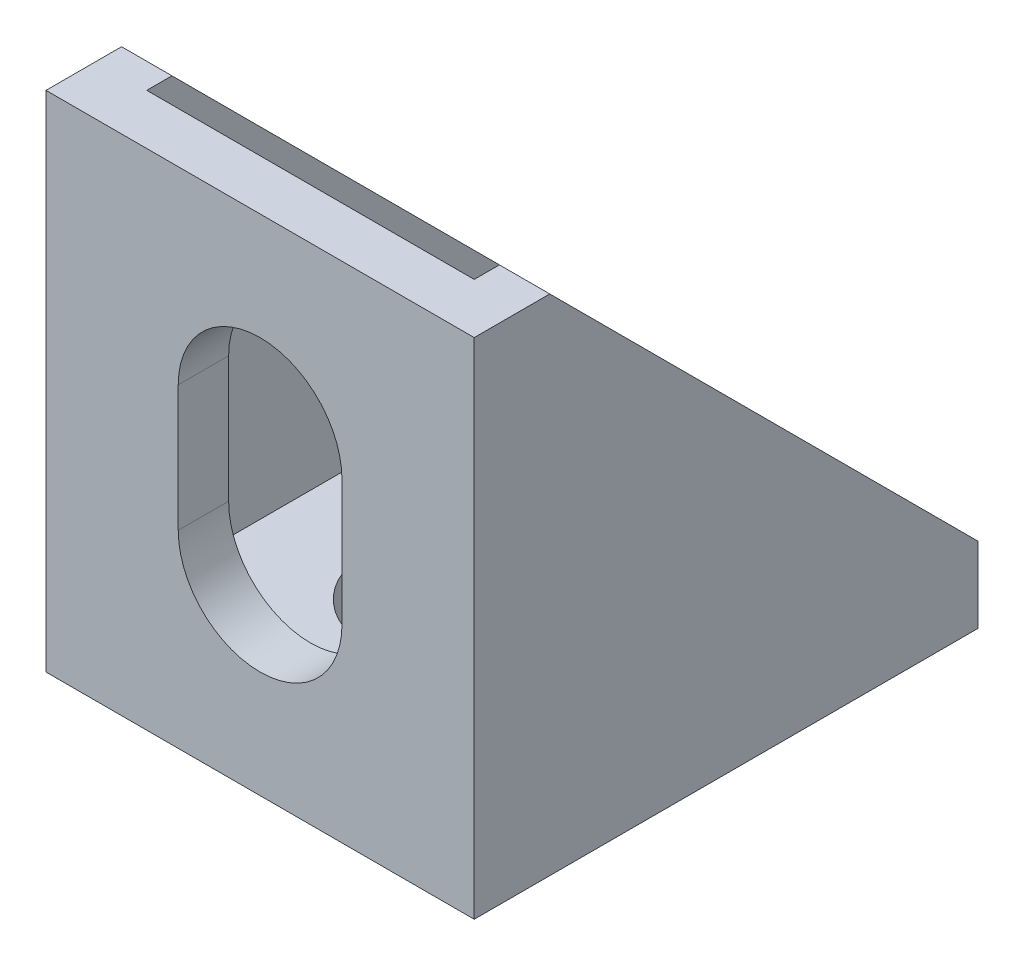
ISO-10303-21;
HEADER;
FILE_DESCRIPTION(('STEP AP214'),'2;1');
FILE_NAME('part.step','',(''),(''),'','','');
FILE_SCHEMA(('AUTOMOTIVE_DESIGN { 1 0 10303 214 1 1 1 1 }'));
ENDSEC;
DATA;
#1=APPLICATION_CONTEXT('core data for automotive mechanical design processes');
#2=APPLICATION_PROTOCOL_DEFINITION('international standard','automotive_design',2000,#1);
#3=PRODUCT_CONTEXT('',#1,'mechanical');
#4=PRODUCT('Part','Part','',(#3));
#5=PRODUCT_RELATED_PRODUCT_CATEGORY('part','',(#4));
#6=PRODUCT_DEFINITION_FORMATION('','',#4);
#7=PRODUCT_DEFINITION_CONTEXT('part definition',#1,'design');
#8=PRODUCT_DEFINITION('design','',#6,#7);
#9=PRODUCT_DEFINITION_SHAPE('','',#8);
#10=(LENGTH_UNIT() NAMED_UNIT(*) SI_UNIT(.MILLI.,.METRE.));
#11=(NAMED_UNIT(*) PLANE_ANGLE_UNIT() SI_UNIT($,.RADIAN.));
#12=(NAMED_UNIT(*) SI_UNIT($,.STERADIAN.) SOLID_ANGLE_UNIT());
#13=UNCERTAINTY_MEASURE_WITH_UNIT(LENGTH_MEASURE(1.E-05),#10,'distance_accuracy_value','');
#14=(GEOMETRIC_REPRESENTATION_CONTEXT(3) GLOBAL_UNCERTAINTY_ASSIGNED_CONTEXT((#13)) GLOBAL_UNIT_ASSIGNED_CONTEXT((#10,
#11,#12)) REPRESENTATION_CONTEXT('',''));
#15=CARTESIAN_POINT('',(0.,0.,0.));
#16=DIRECTION('',(0.,0.,1.));
#17=DIRECTION('',(1.,0.,0.));
#18=AXIS2_PLACEMENT_3D('',#15,#16,#17);
#19=CARTESIAN_POINT('',(8.5,3.,-20.));
#20=DIRECTION('',(0.,-0.707106781186548,0.707106781186548));
#21=DIRECTION('',(0.,-0.707106781186548,-0.707106781186548));
#22=AXIS2_PLACEMENT_3D('',#19,#20,#21);
#23=PLANE('',#22);
#24=DIRECTION('',(-1.,0.,0.));
#25=VECTOR('',#24,1.);
#26=CARTESIAN_POINT('',(8.5,3.,-20.));
#27=LINE('',#26,#25);
#28=CARTESIAN_POINT('',(8.5,3.,-20.));
#29=VERTEX_POINT('',#28);
#30=CARTESIAN_POINT('',(6.5,3.,-20.));
#31=VERTEX_POINT('',#30);
#32=EDGE_CURVE('E274',#29,#31,#27,.T.);
#33=ORIENTED_EDGE('',*,*,#32,.T.);
#34=DIRECTION('',(0.,0.707106781186548,0.707106781186548));
#35=VECTOR('',#34,1.);
#36=CARTESIAN_POINT('',(6.5,3.,-20.));
#37=LINE('',#36,#35);
#38=CARTESIAN_POINT('',(6.5,20.,-3.));
#39=VERTEX_POINT('',#38);
#40=EDGE_CURVE('E247',#31,#39,#37,.T.);
#41=ORIENTED_EDGE('',*,*,#40,.T.);
#42=DIRECTION('',(-1.,0.,0.));
#43=VECTOR('',#42,1.);
#44=CARTESIAN_POINT('',(8.5,20.,-3.));
#45=LINE('',#44,#43);
#46=CARTESIAN_POINT('',(8.5,20.,-3.));
#47=VERTEX_POINT('',#46);
#48=EDGE_CURVE('E12',#47,#39,#45,.T.);
#49=ORIENTED_EDGE('',*,*,#48,.F.);
#50=DIRECTION('',(0.,0.707106781186547,0.707106781186547));
#51=VECTOR('',#50,1.);
#52=CARTESIAN_POINT('',(8.5,3.,-20.));
#53=LINE('',#52,#51);
#54=EDGE_CURVE('E251',#29,#47,#53,.T.);
#55=ORIENTED_EDGE('',*,*,#54,.F.);
#56=EDGE_LOOP('',(#33,#41,#49,#55));
#57=FACE_BOUND('',#56,.T.);
#58=ADVANCED_FACE('F35',(#57),#23,.F.);
#59=CARTESIAN_POINT('',(-6.5,20.,-3.));
#60=VERTEX_POINT('',#59);
#61=CARTESIAN_POINT('',(-8.5,20.,-3.));
#62=VERTEX_POINT('',#61);
#63=EDGE_CURVE('E43',#60,#62,#45,.T.);
#64=ORIENTED_EDGE('',*,*,#63,.F.);
#65=DIRECTION('',(0.,-0.707106781186548,-0.707106781186548));
#66=VECTOR('',#65,1.);
#67=CARTESIAN_POINT('',(-6.5,3.,-20.));
#68=LINE('',#67,#66);
#69=CARTESIAN_POINT('',(-6.5,3.,-20.));
#70=VERTEX_POINT('',#69);
#71=EDGE_CURVE('E244',#60,#70,#68,.T.);
#72=ORIENTED_EDGE('',*,*,#71,.T.);
#73=CARTESIAN_POINT('',(-8.5,3.,-20.));
#74=VERTEX_POINT('',#73);
#75=EDGE_CURVE('E263',#70,#74,#27,.T.);
#76=ORIENTED_EDGE('',*,*,#75,.T.);
#77=DIRECTION('',(0.,0.707106781186547,0.707106781186547));
#78=VECTOR('',#77,1.);
#79=CARTESIAN_POINT('',(-8.5,3.,-20.));
#80=LINE('',#79,#78);
#81=EDGE_CURVE('E250',#74,#62,#80,.T.);
#82=ORIENTED_EDGE('',*,*,#81,.T.);
#83=EDGE_LOOP('',(#64,#72,#76,#82));
#84=FACE_BOUND('',#83,.T.);
#85=ADVANCED_FACE('F37',(#84),#23,.F.);
#86=CARTESIAN_POINT('',(8.5,20.,-3.));
#87=DIRECTION('',(0.,-1.,0.));
#88=DIRECTION('',(0.,0.,-1.));
#89=AXIS2_PLACEMENT_3D('',#86,#87,#88);
#90=PLANE('',#89);
#91=ORIENTED_EDGE('',*,*,#48,.T.);
#92=DIRECTION('',(0.,0.,-1.));
#93=VECTOR('',#92,1.);
#94=CARTESIAN_POINT('',(6.5,20.,21.4009345590327));
#95=LINE('',#94,#93);
#96=CARTESIAN_POINT('',(6.5,20.,-2.));
#97=VERTEX_POINT('',#96);
#98=EDGE_CURVE('E227',#97,#39,#95,.T.);
#99=ORIENTED_EDGE('',*,*,#98,.F.);
#100=DIRECTION('',(-1.,0.,0.));
#101=VECTOR('',#100,1.);
#102=CARTESIAN_POINT('',(6.5,20.,-2.));
#103=LINE('',#102,#101);
#104=CARTESIAN_POINT('',(-6.5,20.,-2.));
#105=VERTEX_POINT('',#104);
#106=EDGE_CURVE('E226',#97,#105,#103,.T.);
#107=ORIENTED_EDGE('',*,*,#106,.T.);
#108=DIRECTION('',(0.,0.,-1.));
#109=VECTOR('',#108,1.);
#110=CARTESIAN_POINT('',(-6.5,20.,21.4009345590327));
#111=LINE('',#110,#109);
#112=EDGE_CURVE('E237',#105,#60,#111,.T.);
#113=ORIENTED_EDGE('',*,*,#112,.T.);
#114=ORIENTED_EDGE('',*,*,#63,.T.);
#115=DIRECTION('',(0.,0.,1.));
#116=VECTOR('',#115,1.);
#117=CARTESIAN_POINT('',(-8.5,20.,-3.));
#118=LINE('',#117,#116);
#119=CARTESIAN_POINT('',(-8.5,20.,0.));
#120=VERTEX_POINT('',#119);
#121=EDGE_CURVE('E266',#62,#120,#118,.T.);
#122=ORIENTED_EDGE('',*,*,#121,.T.);
#123=DIRECTION('',(-1.,0.,0.));
#124=VECTOR('',#123,1.);
#125=CARTESIAN_POINT('',(8.5,20.,0.));
#126=LINE('',#125,#124);
#127=CARTESIAN_POINT('',(8.5,20.,0.));
#128=VERTEX_POINT('',#127);
#129=EDGE_CURVE('E282',#128,#120,#126,.T.);
#130=ORIENTED_EDGE('',*,*,#129,.F.);
#131=DIRECTION('',(0.,0.,1.));
#132=VECTOR('',#131,1.);
#133=CARTESIAN_POINT('',(8.5,20.,-3.));
#134=LINE('',#133,#132);
#135=EDGE_CURVE('E254',#47,#128,#134,.T.);
#136=ORIENTED_EDGE('',*,*,#135,.F.);
#137=EDGE_LOOP('',(#91,#99,#107,#113,#114,#122,#130,#136));
#138=FACE_BOUND('',#137,.T.);
#139=ADVANCED_FACE('F291',(#138),#90,.F.);
#140=CARTESIAN_POINT('',(8.5,20.,0.));
#141=DIRECTION('',(0.,0.,-1.));
#142=DIRECTION('',(0.,1.,0.));
#143=AXIS2_PLACEMENT_3D('',#140,#141,#142);
#144=PLANE('',#143);
#145=DIRECTION('',(0.,-1.,0.));
#146=VECTOR('',#145,1.);
#147=CARTESIAN_POINT('',(3.25,7.5,0.));
#148=LINE('',#147,#146);
#149=CARTESIAN_POINT('',(3.25,12.5,0.));
#150=VERTEX_POINT('',#149);
#151=CARTESIAN_POINT('',(3.25,7.5,0.));
#152=VERTEX_POINT('',#151);
#153=EDGE_CURVE('E202',#150,#152,#148,.T.);
#154=ORIENTED_EDGE('',*,*,#153,.T.);
#155=CARTESIAN_POINT('',(0.,7.5,0.));
#156=DIRECTION('',(0.,0.,-1.));
#157=DIRECTION('',(0.,1.,0.));
#158=AXIS2_PLACEMENT_3D('',#155,#156,#157);
#159=CIRCLE('',#158,3.25);
#160=CARTESIAN_POINT('',(-3.25,7.5,0.));
#161=VERTEX_POINT('',#160);
#162=EDGE_CURVE('E192',#152,#161,#159,.T.);
#163=ORIENTED_EDGE('',*,*,#162,.T.);
#164=DIRECTION('',(0.,1.,0.));
#165=VECTOR('',#164,1.);
#166=CARTESIAN_POINT('',(-3.25,7.5,0.));
#167=LINE('',#166,#165);
#168=CARTESIAN_POINT('',(-3.25,12.5,0.));
#169=VERTEX_POINT('',#168);
#170=EDGE_CURVE('E195',#161,#169,#167,.T.);
#171=ORIENTED_EDGE('',*,*,#170,.T.);
#172=CARTESIAN_POINT('',(0.,12.5,0.));
#173=DIRECTION('',(0.,0.,-1.));
#174=DIRECTION('',(0.,1.,0.));
#175=AXIS2_PLACEMENT_3D('',#172,#173,#174);
#176=CIRCLE('',#175,3.25);
#177=EDGE_CURVE('E199',#169,#150,#176,.T.);
#178=ORIENTED_EDGE('',*,*,#177,.T.);
#179=EDGE_LOOP('',(#154,#163,#171,#178));
#180=FACE_BOUND('',#179,.T.);
#181=DIRECTION('',(0.,-1.,0.));
#182=VECTOR('',#181,1.);
#183=CARTESIAN_POINT('',(-8.5,20.,0.));
#184=LINE('',#183,#182);
#185=CARTESIAN_POINT('',(-8.5,0.,0.));
#186=VERTEX_POINT('',#185);
#187=EDGE_CURVE('E268',#120,#186,#184,.T.);
#188=ORIENTED_EDGE('',*,*,#187,.T.);
#189=DIRECTION('',(-1.,0.,0.));
#190=VECTOR('',#189,1.);
#191=CARTESIAN_POINT('',(8.5,0.,0.));
#192=LINE('',#191,#190);
#193=CARTESIAN_POINT('',(8.5,0.,0.));
#194=VERTEX_POINT('',#193);
#195=EDGE_CURVE('E280',#194,#186,#192,.T.);
#196=ORIENTED_EDGE('',*,*,#195,.F.);
#197=DIRECTION('',(0.,-1.,0.));
#198=VECTOR('',#197,1.);
#199=CARTESIAN_POINT('',(8.5,20.,0.));
#200=LINE('',#199,#198);
#201=EDGE_CURVE('E257',#128,#194,#200,.T.);
#202=ORIENTED_EDGE('',*,*,#201,.F.);
#203=ORIENTED_EDGE('',*,*,#129,.T.);
#204=EDGE_LOOP('',(#188,#196,#202,#203));
#205=FACE_BOUND('',#204,.T.);
#206=ADVANCED_FACE('F309',(#180,#205),#144,.F.);
#207=CARTESIAN_POINT('',(8.5,0.,0.));
#208=DIRECTION('',(0.,1.,0.));
#209=DIRECTION('',(0.,0.,1.));
#210=AXIS2_PLACEMENT_3D('',#207,#208,#209);
#211=PLANE('',#210);
#212=DIRECTION('',(0.,0.,1.));
#213=VECTOR('',#212,1.);
#214=CARTESIAN_POINT('',(-3.25,0.,0.));
#215=LINE('',#214,#213);
#216=CARTESIAN_POINT('',(-3.25,0.,-12.5));
#217=VERTEX_POINT('',#216);
#218=CARTESIAN_POINT('',(-3.25,0.,-7.5));
#219=VERTEX_POINT('',#218);
#220=EDGE_CURVE('E185',#217,#219,#215,.T.);
#221=ORIENTED_EDGE('',*,*,#220,.T.);
#222=CARTESIAN_POINT('',(0.,0.,-7.5));
#223=DIRECTION('',(0.,1.,0.));
#224=DIRECTION('',(0.,0.,1.));
#225=AXIS2_PLACEMENT_3D('',#222,#223,#224);
#226=CIRCLE('',#225,3.25);
#227=CARTESIAN_POINT('',(3.25,0.,-7.5));
#228=VERTEX_POINT('',#227);
#229=EDGE_CURVE('E188',#219,#228,#226,.T.);
#230=ORIENTED_EDGE('',*,*,#229,.T.);
#231=DIRECTION('',(0.,0.,-1.));
#232=VECTOR('',#231,1.);
#233=CARTESIAN_POINT('',(3.25,0.,0.));
#234=LINE('',#233,#232);
#235=CARTESIAN_POINT('',(3.25,0.,-12.5));
#236=VERTEX_POINT('',#235);
#237=EDGE_CURVE('E180',#228,#236,#234,.T.);
#238=ORIENTED_EDGE('',*,*,#237,.T.);
#239=CARTESIAN_POINT('',(0.,0.,-12.5));
#240=DIRECTION('',(0.,1.,0.));
#241=DIRECTION('',(0.,0.,1.));
#242=AXIS2_PLACEMENT_3D('',#239,#240,#241);
#243=CIRCLE('',#242,3.25);
#244=EDGE_CURVE('E160',#236,#217,#243,.T.);
#245=ORIENTED_EDGE('',*,*,#244,.T.);
#246=EDGE_LOOP('',(#221,#230,#238,#245));
#247=FACE_BOUND('',#246,.T.);
#248=DIRECTION('',(0.,0.,-1.));
#249=VECTOR('',#248,1.);
#250=CARTESIAN_POINT('',(-8.5,0.,0.));
#251=LINE('',#250,#249);
#252=CARTESIAN_POINT('',(-8.5,0.,-20.));
#253=VERTEX_POINT('',#252);
#254=EDGE_CURVE('E270',#186,#253,#251,.T.);
#255=ORIENTED_EDGE('',*,*,#254,.T.);
#256=DIRECTION('',(-1.,0.,0.));
#257=VECTOR('',#256,1.);
#258=CARTESIAN_POINT('',(8.5,0.,-20.));
#259=LINE('',#258,#257);
#260=CARTESIAN_POINT('',(8.5,0.,-20.));
#261=VERTEX_POINT('',#260);
#262=EDGE_CURVE('E277',#261,#253,#259,.T.);
#263=ORIENTED_EDGE('',*,*,#262,.F.);
#264=DIRECTION('',(0.,0.,-1.));
#265=VECTOR('',#264,1.);
#266=CARTESIAN_POINT('',(8.5,0.,0.));
#267=LINE('',#266,#265);
#268=EDGE_CURVE('E259',#194,#261,#267,.T.);
#269=ORIENTED_EDGE('',*,*,#268,.F.);
#270=ORIENTED_EDGE('',*,*,#195,.T.);
#271=EDGE_LOOP('',(#255,#263,#269,#270));
#272=FACE_BOUND('',#271,.T.);
#273=ADVANCED_FACE('F306',(#247,#272),#211,.F.);
#274=CARTESIAN_POINT('',(8.5,0.,-20.));
#275=DIRECTION('',(0.,0.,1.));
#276=DIRECTION('',(1.,0.,0.));
#277=AXIS2_PLACEMENT_3D('',#274,#275,#276);
#278=PLANE('',#277);
#279=DIRECTION('',(0.,1.,0.));
#280=VECTOR('',#279,1.);
#281=CARTESIAN_POINT('',(-8.5,0.,-20.));
#282=LINE('',#281,#280);
#283=EDGE_CURVE('E255',#253,#74,#282,.T.);
#284=ORIENTED_EDGE('',*,*,#283,.T.);
#285=ORIENTED_EDGE('',*,*,#75,.F.);
#286=DIRECTION('',(-1.,0.,0.));
#287=VECTOR('',#286,1.);
#288=CARTESIAN_POINT('',(6.5,3.,-20.));
#289=LINE('',#288,#287);
#290=EDGE_CURVE('E217',#31,#70,#289,.T.);
#291=ORIENTED_EDGE('',*,*,#290,.F.);
#292=ORIENTED_EDGE('',*,*,#32,.F.);
#293=DIRECTION('',(0.,1.,0.));
#294=VECTOR('',#293,1.);
#295=CARTESIAN_POINT('',(8.5,0.,-20.));
#296=LINE('',#295,#294);
#297=EDGE_CURVE('E261',#261,#29,#296,.T.);
#298=ORIENTED_EDGE('',*,*,#297,.F.);
#299=ORIENTED_EDGE('',*,*,#262,.T.);
#300=EDGE_LOOP('',(#284,#285,#291,#292,#298,#299));
#301=FACE_BOUND('',#300,.T.);
#302=ADVANCED_FACE('F302',(#301),#278,.F.);
#303=CARTESIAN_POINT('',(8.5,0.,0.));
#304=DIRECTION('',(1.,0.,0.));
#305=DIRECTION('',(0.,0.,-1.));
#306=AXIS2_PLACEMENT_3D('',#303,#304,#305);
#307=PLANE('',#306);
#308=ORIENTED_EDGE('',*,*,#54,.T.);
#309=ORIENTED_EDGE('',*,*,#135,.T.);
#310=ORIENTED_EDGE('',*,*,#201,.T.);
#311=ORIENTED_EDGE('',*,*,#268,.T.);
#312=ORIENTED_EDGE('',*,*,#297,.T.);
#313=EDGE_LOOP('',(#308,#309,#310,#311,#312));
#314=FACE_BOUND('',#313,.T.);
#315=ADVANCED_FACE('F311',(#314),#307,.T.);
#316=CARTESIAN_POINT('',(-8.5,0.,0.));
#317=DIRECTION('',(1.,0.,0.));
#318=DIRECTION('',(0.,0.,-1.));
#319=AXIS2_PLACEMENT_3D('',#316,#317,#318);
#320=PLANE('',#319);
#321=ORIENTED_EDGE('',*,*,#81,.F.);
#322=ORIENTED_EDGE('',*,*,#283,.F.);
#323=ORIENTED_EDGE('',*,*,#254,.F.);
#324=ORIENTED_EDGE('',*,*,#187,.F.);
#325=ORIENTED_EDGE('',*,*,#121,.F.);
#326=EDGE_LOOP('',(#321,#322,#323,#324,#325));
#327=FACE_BOUND('',#326,.T.);
#328=ADVANCED_FACE('F296',(#327),#320,.F.);
#329=CARTESIAN_POINT('',(6.5,3.,21.4009345590327));
#330=DIRECTION('',(1.,0.,0.));
#331=DIRECTION('',(0.,0.,-1.));
#332=AXIS2_PLACEMENT_3D('',#329,#330,#331);
#333=PLANE('',#332);
#334=DIRECTION('',(0.,0.,-1.));
#335=VECTOR('',#334,1.);
#336=CARTESIAN_POINT('',(6.5,3.,21.4009345590327));
#337=LINE('',#336,#335);
#338=CARTESIAN_POINT('',(6.5,3.,-2.));
#339=VERTEX_POINT('',#338);
#340=EDGE_CURVE('E235',#339,#31,#337,.T.);
#341=ORIENTED_EDGE('',*,*,#340,.F.);
#342=DIRECTION('',(0.,1.,0.));
#343=VECTOR('',#342,1.);
#344=CARTESIAN_POINT('',(6.5,3.,-2.));
#345=LINE('',#344,#343);
#346=EDGE_CURVE('E230',#339,#97,#345,.T.);
#347=ORIENTED_EDGE('',*,*,#346,.T.);
#348=ORIENTED_EDGE('',*,*,#98,.T.);
#349=ORIENTED_EDGE('',*,*,#40,.F.);
#350=EDGE_LOOP('',(#341,#347,#348,#349));
#351=FACE_BOUND('',#350,.T.);
#352=ADVANCED_FACE('F320',(#351),#333,.F.);
#353=CARTESIAN_POINT('',(-6.5,3.,21.4009345590327));
#354=DIRECTION('',(-1.,0.,0.));
#355=DIRECTION('',(0.,0.,1.));
#356=AXIS2_PLACEMENT_3D('',#353,#354,#355);
#357=PLANE('',#356);
#358=ORIENTED_EDGE('',*,*,#112,.F.);
#359=DIRECTION('',(0.,-1.,0.));
#360=VECTOR('',#359,1.);
#361=CARTESIAN_POINT('',(-6.5,3.,-2.));
#362=LINE('',#361,#360);
#363=CARTESIAN_POINT('',(-6.5,3.,-2.));
#364=VERTEX_POINT('',#363);
#365=EDGE_CURVE('E224',#105,#364,#362,.T.);
#366=ORIENTED_EDGE('',*,*,#365,.T.);
#367=DIRECTION('',(0.,0.,-1.));
#368=VECTOR('',#367,1.);
#369=CARTESIAN_POINT('',(-6.5,3.,21.4009345590327));
#370=LINE('',#369,#368);
#371=EDGE_CURVE('E240',#364,#70,#370,.T.);
#372=ORIENTED_EDGE('',*,*,#371,.T.);
#373=ORIENTED_EDGE('',*,*,#71,.F.);
#374=EDGE_LOOP('',(#358,#366,#372,#373));
#375=FACE_BOUND('',#374,.T.);
#376=ADVANCED_FACE('F328',(#375),#357,.F.);
#377=CARTESIAN_POINT('',(6.5,3.,21.4009345590327));
#378=DIRECTION('',(0.,-1.,0.));
#379=DIRECTION('',(0.,0.,-1.));
#380=AXIS2_PLACEMENT_3D('',#377,#378,#379);
#381=PLANE('',#380);
#382=DIRECTION('',(0.,0.,-1.));
#383=VECTOR('',#382,1.);
#384=CARTESIAN_POINT('',(3.25,3.,-7.5));
#385=LINE('',#384,#383);
#386=CARTESIAN_POINT('',(3.25,3.,-7.5));
#387=VERTEX_POINT('',#386);
#388=CARTESIAN_POINT('',(3.25,3.,-12.5));
#389=VERTEX_POINT('',#388);
#390=EDGE_CURVE('E166',#387,#389,#385,.T.);
#391=ORIENTED_EDGE('',*,*,#390,.F.);
#392=CARTESIAN_POINT('',(0.,3.,-7.5));
#393=DIRECTION('',(0.,1.,0.));
#394=DIRECTION('',(0.,0.,1.));
#395=AXIS2_PLACEMENT_3D('',#392,#393,#394);
#396=CIRCLE('',#395,3.25);
#397=CARTESIAN_POINT('',(-3.25,3.,-7.5));
#398=VERTEX_POINT('',#397);
#399=EDGE_CURVE('E58',#398,#387,#396,.T.);
#400=ORIENTED_EDGE('',*,*,#399,.F.);
#401=DIRECTION('',(0.,0.,1.));
#402=VECTOR('',#401,1.);
#403=CARTESIAN_POINT('',(-3.25,3.,-7.5));
#404=LINE('',#403,#402);
#405=CARTESIAN_POINT('',(-3.25,3.,-12.5));
#406=VERTEX_POINT('',#405);
#407=EDGE_CURVE('E173',#406,#398,#404,.T.);
#408=ORIENTED_EDGE('',*,*,#407,.F.);
#409=CARTESIAN_POINT('',(0.,3.,-12.5));
#410=DIRECTION('',(0.,1.,0.));
#411=DIRECTION('',(0.,0.,1.));
#412=AXIS2_PLACEMENT_3D('',#409,#410,#411);
#413=CIRCLE('',#412,3.25);
#414=EDGE_CURVE('E157',#389,#406,#413,.T.);
#415=ORIENTED_EDGE('',*,*,#414,.F.);
#416=EDGE_LOOP('',(#391,#400,#408,#415));
#417=FACE_BOUND('',#416,.T.);
#418=DIRECTION('',(1.,0.,0.));
#419=VECTOR('',#418,1.);
#420=CARTESIAN_POINT('',(6.5,3.,-2.));
#421=LINE('',#420,#419);
#422=EDGE_CURVE('E232',#364,#339,#421,.T.);
#423=ORIENTED_EDGE('',*,*,#422,.T.);
#424=ORIENTED_EDGE('',*,*,#340,.T.);
#425=ORIENTED_EDGE('',*,*,#290,.T.);
#426=ORIENTED_EDGE('',*,*,#371,.F.);
#427=EDGE_LOOP('',(#423,#424,#425,#426));
#428=FACE_BOUND('',#427,.T.);
#429=ADVANCED_FACE('F170',(#417,#428),#381,.F.);
#430=CARTESIAN_POINT('',(8.5,20.,-2.));
#431=DIRECTION('',(0.,0.,-1.));
#432=DIRECTION('',(0.,1.,0.));
#433=AXIS2_PLACEMENT_3D('',#430,#431,#432);
#434=PLANE('',#433);
#435=CARTESIAN_POINT('',(0.,7.5,-2.));
#436=DIRECTION('',(0.,0.,-1.));
#437=DIRECTION('',(0.,1.,0.));
#438=AXIS2_PLACEMENT_3D('',#435,#436,#437);
#439=CIRCLE('',#438,3.25);
#440=CARTESIAN_POINT('',(3.25,7.5,-2.));
#441=VERTEX_POINT('',#440);
#442=CARTESIAN_POINT('',(-3.25,7.5,-2.));
#443=VERTEX_POINT('',#442);
#444=EDGE_CURVE('E191',#441,#443,#439,.T.);
#445=ORIENTED_EDGE('',*,*,#444,.F.);
#446=DIRECTION('',(0.,-1.,0.));
#447=VECTOR('',#446,1.);
#448=CARTESIAN_POINT('',(3.25,7.5,-2.));
#449=LINE('',#448,#447);
#450=CARTESIAN_POINT('',(3.25,12.5,-2.));
#451=VERTEX_POINT('',#450);
#452=EDGE_CURVE('E196',#451,#441,#449,.T.);
#453=ORIENTED_EDGE('',*,*,#452,.F.);
#454=CARTESIAN_POINT('',(0.,12.5,-2.));
#455=DIRECTION('',(0.,0.,-1.));
#456=DIRECTION('',(0.,1.,0.));
#457=AXIS2_PLACEMENT_3D('',#454,#455,#456);
#458=CIRCLE('',#457,3.25);
#459=CARTESIAN_POINT('',(-3.25,12.5,-2.));
#460=VERTEX_POINT('',#459);
#461=EDGE_CURVE('E210',#460,#451,#458,.T.);
#462=ORIENTED_EDGE('',*,*,#461,.F.);
#463=DIRECTION('',(0.,1.,0.));
#464=VECTOR('',#463,1.);
#465=CARTESIAN_POINT('',(-3.25,7.5,-2.));
#466=LINE('',#465,#464);
#467=EDGE_CURVE('E207',#443,#460,#466,.T.);
#468=ORIENTED_EDGE('',*,*,#467,.F.);
#469=EDGE_LOOP('',(#445,#453,#462,#468));
#470=FACE_BOUND('',#469,.T.);
#471=ORIENTED_EDGE('',*,*,#346,.F.);
#472=ORIENTED_EDGE('',*,*,#422,.F.);
#473=ORIENTED_EDGE('',*,*,#365,.F.);
#474=ORIENTED_EDGE('',*,*,#106,.F.);
#475=EDGE_LOOP('',(#471,#472,#473,#474));
#476=FACE_BOUND('',#475,.T.);
#477=ADVANCED_FACE('F326',(#470,#476),#434,.T.);
#478=CARTESIAN_POINT('',(0.,7.5,0.));
#479=DIRECTION('',(0.,0.,-1.));
#480=DIRECTION('',(0.,1.,0.));
#481=AXIS2_PLACEMENT_3D('',#478,#479,#480);
#482=CYLINDRICAL_SURFACE('',#481,3.25);
#483=ORIENTED_EDGE('',*,*,#444,.T.);
#484=DIRECTION('',(0.,0.,-1.));
#485=VECTOR('',#484,1.);
#486=CARTESIAN_POINT('',(-3.25,7.5,0.));
#487=LINE('',#486,#485);
#488=EDGE_CURVE('E205',#161,#443,#487,.T.);
#489=ORIENTED_EDGE('',*,*,#488,.F.);
#490=ORIENTED_EDGE('',*,*,#162,.F.);
#491=DIRECTION('',(0.,0.,-1.));
#492=VECTOR('',#491,1.);
#493=CARTESIAN_POINT('',(3.25,7.5,0.));
#494=LINE('',#493,#492);
#495=EDGE_CURVE('E215',#152,#441,#494,.T.);
#496=ORIENTED_EDGE('',*,*,#495,.T.);
#497=EDGE_LOOP('',(#483,#489,#490,#496));
#498=FACE_BOUND('',#497,.T.);
#499=ADVANCED_FACE('F396',(#498),#482,.F.);
#500=CARTESIAN_POINT('',(3.25,7.5,0.));
#501=DIRECTION('',(1.,0.,0.));
#502=DIRECTION('',(0.,1.,0.));
#503=AXIS2_PLACEMENT_3D('',#500,#501,#502);
#504=PLANE('',#503);
#505=ORIENTED_EDGE('',*,*,#452,.T.);
#506=ORIENTED_EDGE('',*,*,#495,.F.);
#507=ORIENTED_EDGE('',*,*,#153,.F.);
#508=DIRECTION('',(0.,0.,-1.));
#509=VECTOR('',#508,1.);
#510=CARTESIAN_POINT('',(3.25,12.5,0.));
#511=LINE('',#510,#509);
#512=EDGE_CURVE('E218',#150,#451,#511,.T.);
#513=ORIENTED_EDGE('',*,*,#512,.T.);
#514=EDGE_LOOP('',(#505,#506,#507,#513));
#515=FACE_BOUND('',#514,.T.);
#516=ADVANCED_FACE('F405',(#515),#504,.F.);
#517=CARTESIAN_POINT('',(0.,12.5,0.));
#518=DIRECTION('',(0.,0.,-1.));
#519=DIRECTION('',(0.,1.,0.));
#520=AXIS2_PLACEMENT_3D('',#517,#518,#519);
#521=CYLINDRICAL_SURFACE('',#520,3.25);
#522=ORIENTED_EDGE('',*,*,#461,.T.);
#523=ORIENTED_EDGE('',*,*,#512,.F.);
#524=ORIENTED_EDGE('',*,*,#177,.F.);
#525=DIRECTION('',(0.,0.,-1.));
#526=VECTOR('',#525,1.);
#527=CARTESIAN_POINT('',(-3.25,12.5,0.));
#528=LINE('',#527,#526);
#529=EDGE_CURVE('E220',#169,#460,#528,.T.);
#530=ORIENTED_EDGE('',*,*,#529,.T.);
#531=EDGE_LOOP('',(#522,#523,#524,#530));
#532=FACE_BOUND('',#531,.T.);
#533=ADVANCED_FACE('F415',(#532),#521,.F.);
#534=CARTESIAN_POINT('',(-3.25,7.5,0.));
#535=DIRECTION('',(-1.,0.,0.));
#536=DIRECTION('',(0.,-1.,0.));
#537=AXIS2_PLACEMENT_3D('',#534,#535,#536);
#538=PLANE('',#537);
#539=ORIENTED_EDGE('',*,*,#467,.T.);
#540=ORIENTED_EDGE('',*,*,#529,.F.);
#541=ORIENTED_EDGE('',*,*,#170,.F.);
#542=ORIENTED_EDGE('',*,*,#488,.T.);
#543=EDGE_LOOP('',(#539,#540,#541,#542));
#544=FACE_BOUND('',#543,.T.);
#545=ADVANCED_FACE('F425',(#544),#538,.F.);
#546=CARTESIAN_POINT('',(0.,-14.,-7.5));
#547=DIRECTION('',(0.,1.,0.));
#548=DIRECTION('',(0.,0.,1.));
#549=AXIS2_PLACEMENT_3D('',#546,#547,#548);
#550=CYLINDRICAL_SURFACE('',#549,3.25);
#551=DIRECTION('',(0.,1.,0.));
#552=VECTOR('',#551,1.);
#553=CARTESIAN_POINT('',(-3.25,-14.,-7.5));
#554=LINE('',#553,#552);
#555=EDGE_CURVE('E178',#219,#398,#554,.T.);
#556=ORIENTED_EDGE('',*,*,#555,.T.);
#557=ORIENTED_EDGE('',*,*,#399,.T.);
#558=DIRECTION('',(0.,1.,0.));
#559=VECTOR('',#558,1.);
#560=CARTESIAN_POINT('',(3.25,-14.,-7.5));
#561=LINE('',#560,#559);
#562=EDGE_CURVE('E163',#228,#387,#561,.T.);
#563=ORIENTED_EDGE('',*,*,#562,.F.);
#564=ORIENTED_EDGE('',*,*,#229,.F.);
#565=EDGE_LOOP('',(#556,#557,#563,#564));
#566=FACE_BOUND('',#565,.T.);
#567=ADVANCED_FACE('F435',(#566),#550,.F.);
#568=CARTESIAN_POINT('',(-3.25,-14.,-7.5));
#569=DIRECTION('',(-1.,0.,0.));
#570=DIRECTION('',(0.,0.,1.));
#571=AXIS2_PLACEMENT_3D('',#568,#569,#570);
#572=PLANE('',#571);
#573=DIRECTION('',(0.,1.,0.));
#574=VECTOR('',#573,1.);
#575=CARTESIAN_POINT('',(-3.25,-14.,-12.5));
#576=LINE('',#575,#574);
#577=EDGE_CURVE('E162',#217,#406,#576,.T.);
#578=ORIENTED_EDGE('',*,*,#577,.T.);
#579=ORIENTED_EDGE('',*,*,#407,.T.);
#580=ORIENTED_EDGE('',*,*,#555,.F.);
#581=ORIENTED_EDGE('',*,*,#220,.F.);
#582=EDGE_LOOP('',(#578,#579,#580,#581));
#583=FACE_BOUND('',#582,.T.);
#584=ADVANCED_FACE('F455',(#583),#572,.F.);
#585=CARTESIAN_POINT('',(0.,-14.,-12.5));
#586=DIRECTION('',(0.,1.,0.));
#587=DIRECTION('',(0.,0.,1.));
#588=AXIS2_PLACEMENT_3D('',#585,#586,#587);
#589=CYLINDRICAL_SURFACE('',#588,3.25);
#590=DIRECTION('',(0.,1.,0.));
#591=VECTOR('',#590,1.);
#592=CARTESIAN_POINT('',(3.25,-14.,-12.5));
#593=LINE('',#592,#591);
#594=EDGE_CURVE('E50',#236,#389,#593,.T.);
#595=ORIENTED_EDGE('',*,*,#594,.T.);
#596=ORIENTED_EDGE('',*,*,#414,.T.);
#597=ORIENTED_EDGE('',*,*,#577,.F.);
#598=ORIENTED_EDGE('',*,*,#244,.F.);
#599=EDGE_LOOP('',(#595,#596,#597,#598));
#600=FACE_BOUND('',#599,.T.);
#601=ADVANCED_FACE('F154',(#600),#589,.F.);
#602=CARTESIAN_POINT('',(3.25,-14.,-7.5));
#603=DIRECTION('',(1.,0.,0.));
#604=DIRECTION('',(0.,0.,-1.));
#605=AXIS2_PLACEMENT_3D('',#602,#603,#604);
#606=PLANE('',#605);
#607=ORIENTED_EDGE('',*,*,#562,.T.);
#608=ORIENTED_EDGE('',*,*,#390,.T.);
#609=ORIENTED_EDGE('',*,*,#594,.F.);
#610=ORIENTED_EDGE('',*,*,#237,.F.);
#611=EDGE_LOOP('',(#607,#608,#609,#610));
#612=FACE_BOUND('',#611,.T.);
#613=ADVANCED_FACE('F167',(#612),#606,.F.);
#614=CLOSED_SHELL('',(#58,#85,#139,#206,#273,#302,#315,#328,#352,#376,#429,#477,#499,#516,#533,
#545,#567,#584,#601,#613));
#615=MANIFOLD_SOLID_BREP('B2',#614);
#616=ADVANCED_BREP_SHAPE_REPRESENTATION('',(#18,#615),#14);
#617=SHAPE_DEFINITION_REPRESENTATION(#9,#616);
ENDSEC;
END-ISO-10303-21;
